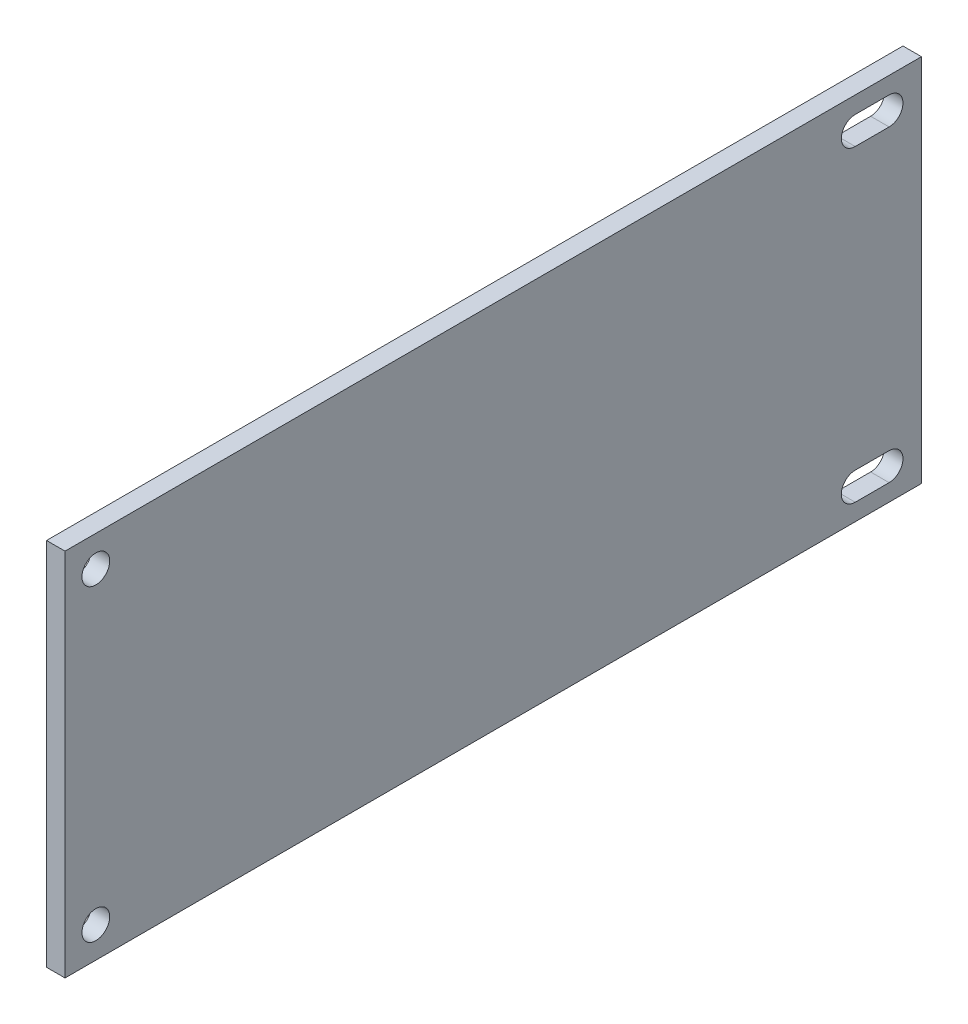
ISO-10303-21;
HEADER;
FILE_DESCRIPTION(('STEP AP214'),'2;1');
FILE_NAME('part.step','',(''),(''),'','','');
FILE_SCHEMA(('AUTOMOTIVE_DESIGN { 1 0 10303 214 1 1 1 1 }'));
ENDSEC;
DATA;
#1=APPLICATION_CONTEXT('core data for automotive mechanical design processes');
#2=APPLICATION_PROTOCOL_DEFINITION('international standard','automotive_design',2000,#1);
#3=PRODUCT_CONTEXT('',#1,'mechanical');
#4=PRODUCT('Part','Part','',(#3));
#5=PRODUCT_RELATED_PRODUCT_CATEGORY('part','',(#4));
#6=PRODUCT_DEFINITION_FORMATION('','',#4);
#7=PRODUCT_DEFINITION_CONTEXT('part definition',#1,'design');
#8=PRODUCT_DEFINITION('design','',#6,#7);
#9=PRODUCT_DEFINITION_SHAPE('','',#8);
#10=(LENGTH_UNIT() NAMED_UNIT(*) SI_UNIT(.MILLI.,.METRE.));
#11=(NAMED_UNIT(*) PLANE_ANGLE_UNIT() SI_UNIT($,.RADIAN.));
#12=(NAMED_UNIT(*) SI_UNIT($,.STERADIAN.) SOLID_ANGLE_UNIT());
#13=UNCERTAINTY_MEASURE_WITH_UNIT(LENGTH_MEASURE(1.E-05),#10,'distance_accuracy_value','');
#14=(GEOMETRIC_REPRESENTATION_CONTEXT(3) GLOBAL_UNCERTAINTY_ASSIGNED_CONTEXT((#13)) GLOBAL_UNIT_ASSIGNED_CONTEXT((#10,
#11,#12)) REPRESENTATION_CONTEXT('',''));
#15=CARTESIAN_POINT('',(0.,0.,0.));
#16=DIRECTION('',(0.,0.,1.));
#17=DIRECTION('',(1.,0.,0.));
#18=AXIS2_PLACEMENT_3D('',#15,#16,#17);
#19=CARTESIAN_POINT('',(1.5,60.,0.));
#20=DIRECTION('',(0.,0.,-1.));
#21=DIRECTION('',(-1.,0.,0.));
#22=AXIS2_PLACEMENT_3D('',#19,#20,#21);
#23=PLANE('',#22);
#24=DIRECTION('',(0.,-1.,0.));
#25=VECTOR('',#24,1.);
#26=CARTESIAN_POINT('',(-1.5,60.,0.));
#27=LINE('',#26,#25);
#28=CARTESIAN_POINT('',(-1.5,60.,0.));
#29=VERTEX_POINT('',#28);
#30=CARTESIAN_POINT('',(-1.5,0.,0.));
#31=VERTEX_POINT('',#30);
#32=EDGE_CURVE('E347',#29,#31,#27,.T.);
#33=ORIENTED_EDGE('',*,*,#32,.T.);
#34=DIRECTION('',(-1.,0.,0.));
#35=VECTOR('',#34,1.);
#36=CARTESIAN_POINT('',(1.5,0.,0.));
#37=LINE('',#36,#35);
#38=CARTESIAN_POINT('',(1.5,0.,0.));
#39=VERTEX_POINT('',#38);
#40=EDGE_CURVE('E13',#39,#31,#37,.T.);
#41=ORIENTED_EDGE('',*,*,#40,.F.);
#42=DIRECTION('',(0.,-1.,0.));
#43=VECTOR('',#42,1.);
#44=CARTESIAN_POINT('',(1.5,60.,0.));
#45=LINE('',#44,#43);
#46=CARTESIAN_POINT('',(1.5,60.,0.));
#47=VERTEX_POINT('',#46);
#48=EDGE_CURVE('E348',#47,#39,#45,.T.);
#49=ORIENTED_EDGE('',*,*,#48,.F.);
#50=DIRECTION('',(-1.,0.,0.));
#51=VECTOR('',#50,1.);
#52=CARTESIAN_POINT('',(1.5,60.,0.));
#53=LINE('',#52,#51);
#54=EDGE_CURVE('E358',#47,#29,#53,.T.);
#55=ORIENTED_EDGE('',*,*,#54,.T.);
#56=EDGE_LOOP('',(#33,#41,#49,#55));
#57=FACE_BOUND('',#56,.T.);
#58=ADVANCED_FACE('F185',(#57),#23,.F.);
#59=CARTESIAN_POINT('',(1.5,0.,-139.));
#60=DIRECTION('',(0.,1.,0.));
#61=DIRECTION('',(0.,0.,1.));
#62=AXIS2_PLACEMENT_3D('',#59,#60,#61);
#63=PLANE('',#62);
#64=DIRECTION('',(0.,0.,-1.));
#65=VECTOR('',#64,1.);
#66=CARTESIAN_POINT('',(-1.5,0.,-139.));
#67=LINE('',#66,#65);
#68=CARTESIAN_POINT('',(-1.5,0.,-139.));
#69=VERTEX_POINT('',#68);
#70=EDGE_CURVE('E361',#31,#69,#67,.T.);
#71=ORIENTED_EDGE('',*,*,#70,.T.);
#72=DIRECTION('',(-1.,0.,0.));
#73=VECTOR('',#72,1.);
#74=CARTESIAN_POINT('',(1.5,0.,-139.));
#75=LINE('',#74,#73);
#76=CARTESIAN_POINT('',(1.5,0.,-139.));
#77=VERTEX_POINT('',#76);
#78=EDGE_CURVE('E192',#77,#69,#75,.T.);
#79=ORIENTED_EDGE('',*,*,#78,.F.);
#80=DIRECTION('',(0.,0.,-1.));
#81=VECTOR('',#80,1.);
#82=CARTESIAN_POINT('',(1.5,0.,-139.));
#83=LINE('',#82,#81);
#84=EDGE_CURVE('E351',#39,#77,#83,.T.);
#85=ORIENTED_EDGE('',*,*,#84,.F.);
#86=ORIENTED_EDGE('',*,*,#40,.T.);
#87=EDGE_LOOP('',(#71,#79,#85,#86));
#88=FACE_BOUND('',#87,.T.);
#89=ADVANCED_FACE('F390',(#88),#63,.F.);
#90=CARTESIAN_POINT('',(1.5,60.,-139.));
#91=DIRECTION('',(0.,0.,1.));
#92=DIRECTION('',(1.,0.,0.));
#93=AXIS2_PLACEMENT_3D('',#90,#91,#92);
#94=PLANE('',#93);
#95=DIRECTION('',(0.,1.,0.));
#96=VECTOR('',#95,1.);
#97=CARTESIAN_POINT('',(-1.5,60.,-139.));
#98=LINE('',#97,#96);
#99=CARTESIAN_POINT('',(-1.5,60.,-139.));
#100=VERTEX_POINT('',#99);
#101=EDGE_CURVE('E363',#69,#100,#98,.T.);
#102=ORIENTED_EDGE('',*,*,#101,.T.);
#103=DIRECTION('',(-1.,0.,0.));
#104=VECTOR('',#103,1.);
#105=CARTESIAN_POINT('',(1.5,60.,-139.));
#106=LINE('',#105,#104);
#107=CARTESIAN_POINT('',(1.5,60.,-139.));
#108=VERTEX_POINT('',#107);
#109=EDGE_CURVE('E368',#108,#100,#106,.T.);
#110=ORIENTED_EDGE('',*,*,#109,.F.);
#111=DIRECTION('',(0.,1.,0.));
#112=VECTOR('',#111,1.);
#113=CARTESIAN_POINT('',(1.5,60.,-139.));
#114=LINE('',#113,#112);
#115=EDGE_CURVE('E354',#77,#108,#114,.T.);
#116=ORIENTED_EDGE('',*,*,#115,.F.);
#117=ORIENTED_EDGE('',*,*,#78,.T.);
#118=EDGE_LOOP('',(#102,#110,#116,#117));
#119=FACE_BOUND('',#118,.T.);
#120=ADVANCED_FACE('F375',(#119),#94,.F.);
#121=CARTESIAN_POINT('',(1.5,60.,-139.));
#122=DIRECTION('',(0.,-1.,0.));
#123=DIRECTION('',(0.,0.,-1.));
#124=AXIS2_PLACEMENT_3D('',#121,#122,#123);
#125=PLANE('',#124);
#126=DIRECTION('',(0.,0.,1.));
#127=VECTOR('',#126,1.);
#128=CARTESIAN_POINT('',(-1.5,60.,-139.));
#129=LINE('',#128,#127);
#130=EDGE_CURVE('E352',#100,#29,#129,.T.);
#131=ORIENTED_EDGE('',*,*,#130,.T.);
#132=ORIENTED_EDGE('',*,*,#54,.F.);
#133=DIRECTION('',(0.,0.,1.));
#134=VECTOR('',#133,1.);
#135=CARTESIAN_POINT('',(1.5,60.,-139.));
#136=LINE('',#135,#134);
#137=EDGE_CURVE('E356',#108,#47,#136,.T.);
#138=ORIENTED_EDGE('',*,*,#137,.F.);
#139=ORIENTED_EDGE('',*,*,#109,.T.);
#140=EDGE_LOOP('',(#131,#132,#138,#139));
#141=FACE_BOUND('',#140,.T.);
#142=ADVANCED_FACE('F383',(#141),#125,.F.);
#143=CARTESIAN_POINT('',(1.5,0.,0.));
#144=DIRECTION('',(-1.,0.,0.));
#145=DIRECTION('',(0.,0.,1.));
#146=AXIS2_PLACEMENT_3D('',#143,#144,#145);
#147=PLANE('',#146);
#148=CARTESIAN_POINT('',(1.5,55.,-133.75));
#149=DIRECTION('',(1.,0.,0.));
#150=DIRECTION('',(0.,0.,-1.));
#151=AXIS2_PLACEMENT_3D('',#148,#149,#150);
#152=CIRCLE('',#151,2.25);
#153=CARTESIAN_POINT('',(1.5,52.75,-133.75));
#154=VERTEX_POINT('',#153);
#155=CARTESIAN_POINT('',(1.5,57.25,-133.75));
#156=VERTEX_POINT('',#155);
#157=EDGE_CURVE('E285',#154,#156,#152,.T.);
#158=ORIENTED_EDGE('',*,*,#157,.F.);
#159=DIRECTION('',(0.,0.,1.));
#160=VECTOR('',#159,1.);
#161=CARTESIAN_POINT('',(1.5,52.75,-133.75));
#162=LINE('',#161,#160);
#163=CARTESIAN_POINT('',(1.5,52.75,-128.25));
#164=VERTEX_POINT('',#163);
#165=EDGE_CURVE('E287',#154,#164,#162,.T.);
#166=ORIENTED_EDGE('',*,*,#165,.T.);
#167=CARTESIAN_POINT('',(1.5,55.,-128.25));
#168=DIRECTION('',(1.,0.,0.));
#169=DIRECTION('',(0.,0.,-1.));
#170=AXIS2_PLACEMENT_3D('',#167,#168,#169);
#171=CIRCLE('',#170,2.25);
#172=CARTESIAN_POINT('',(1.5,57.25,-128.25));
#173=VERTEX_POINT('',#172);
#174=EDGE_CURVE('E297',#173,#164,#171,.T.);
#175=ORIENTED_EDGE('',*,*,#174,.F.);
#176=DIRECTION('',(0.,0.,1.));
#177=VECTOR('',#176,1.);
#178=CARTESIAN_POINT('',(1.5,57.25,-133.75));
#179=LINE('',#178,#177);
#180=EDGE_CURVE('E276',#156,#173,#179,.T.);
#181=ORIENTED_EDGE('',*,*,#180,.F.);
#182=EDGE_LOOP('',(#158,#166,#175,#181));
#183=FACE_BOUND('',#182,.T.);
#184=CARTESIAN_POINT('',(1.5,5.,-133.75));
#185=DIRECTION('',(1.,0.,0.));
#186=DIRECTION('',(0.,0.,-1.));
#187=AXIS2_PLACEMENT_3D('',#184,#185,#186);
#188=CIRCLE('',#187,2.25);
#189=CARTESIAN_POINT('',(1.5,2.75000000000006,-133.75));
#190=VERTEX_POINT('',#189);
#191=CARTESIAN_POINT('',(1.5,7.25,-133.75));
#192=VERTEX_POINT('',#191);
#193=EDGE_CURVE('E317',#190,#192,#188,.T.);
#194=ORIENTED_EDGE('',*,*,#193,.F.);
#195=DIRECTION('',(0.,0.,1.));
#196=VECTOR('',#195,1.);
#197=CARTESIAN_POINT('',(1.5,2.75,-133.75));
#198=LINE('',#197,#196);
#199=CARTESIAN_POINT('',(1.5,2.75,-128.25));
#200=VERTEX_POINT('',#199);
#201=EDGE_CURVE('E311',#190,#200,#198,.T.);
#202=ORIENTED_EDGE('',*,*,#201,.T.);
#203=CARTESIAN_POINT('',(1.5,5.,-128.25));
#204=DIRECTION('',(1.,0.,0.));
#205=DIRECTION('',(0.,0.,-1.));
#206=AXIS2_PLACEMENT_3D('',#203,#204,#205);
#207=CIRCLE('',#206,2.25);
#208=CARTESIAN_POINT('',(1.5,7.25000000000005,-128.25));
#209=VERTEX_POINT('',#208);
#210=EDGE_CURVE('E327',#209,#200,#207,.T.);
#211=ORIENTED_EDGE('',*,*,#210,.F.);
#212=DIRECTION('',(0.,0.,1.));
#213=VECTOR('',#212,1.);
#214=CARTESIAN_POINT('',(1.5,7.25000000000005,-133.75));
#215=LINE('',#214,#213);
#216=EDGE_CURVE('E304',#192,#209,#215,.T.);
#217=ORIENTED_EDGE('',*,*,#216,.F.);
#218=EDGE_LOOP('',(#194,#202,#211,#217));
#219=FACE_BOUND('',#218,.T.);
#220=CARTESIAN_POINT('',(1.5,55.,-5.));
#221=DIRECTION('',(1.,0.,0.));
#222=DIRECTION('',(0.,0.,-1.));
#223=AXIS2_PLACEMENT_3D('',#220,#221,#222);
#224=CIRCLE('',#223,2.25);
#225=CARTESIAN_POINT('',(1.5,55.,-7.25));
#226=VERTEX_POINT('',#225);
#227=EDGE_CURVE('E335',#226,#226,#224,.T.);
#228=ORIENTED_EDGE('',*,*,#227,.F.);
#229=EDGE_LOOP('',(#228));
#230=FACE_BOUND('',#229,.T.);
#231=CARTESIAN_POINT('',(1.5,5.,-5.));
#232=DIRECTION('',(1.,0.,0.));
#233=DIRECTION('',(0.,0.,-1.));
#234=AXIS2_PLACEMENT_3D('',#231,#232,#233);
#235=CIRCLE('',#234,2.25);
#236=CARTESIAN_POINT('',(1.5,5.,-7.25));
#237=VERTEX_POINT('',#236);
#238=EDGE_CURVE('E341',#237,#237,#235,.T.);
#239=ORIENTED_EDGE('',*,*,#238,.F.);
#240=EDGE_LOOP('',(#239));
#241=FACE_BOUND('',#240,.T.);
#242=ORIENTED_EDGE('',*,*,#48,.T.);
#243=ORIENTED_EDGE('',*,*,#84,.T.);
#244=ORIENTED_EDGE('',*,*,#115,.T.);
#245=ORIENTED_EDGE('',*,*,#137,.T.);
#246=EDGE_LOOP('',(#242,#243,#244,#245));
#247=FACE_BOUND('',#246,.T.);
#248=ADVANCED_FACE('F389',(#183,#219,#230,#241,#247),#147,.F.);
#249=CARTESIAN_POINT('',(-1.5,0.,0.));
#250=DIRECTION('',(-1.,0.,0.));
#251=DIRECTION('',(0.,0.,1.));
#252=AXIS2_PLACEMENT_3D('',#249,#250,#251);
#253=PLANE('',#252);
#254=DIRECTION('',(0.,0.,1.));
#255=VECTOR('',#254,1.);
#256=CARTESIAN_POINT('',(-1.5,52.75,-133.75));
#257=LINE('',#256,#255);
#258=CARTESIAN_POINT('',(-1.5,52.75,-133.75));
#259=VERTEX_POINT('',#258);
#260=CARTESIAN_POINT('',(-1.5,52.75,-128.25));
#261=VERTEX_POINT('',#260);
#262=EDGE_CURVE('E275',#259,#261,#257,.T.);
#263=ORIENTED_EDGE('',*,*,#262,.F.);
#264=CARTESIAN_POINT('',(-1.5,55.,-133.75));
#265=DIRECTION('',(1.,0.,0.));
#266=DIRECTION('',(0.,0.,-1.));
#267=AXIS2_PLACEMENT_3D('',#264,#265,#266);
#268=CIRCLE('',#267,2.25);
#269=CARTESIAN_POINT('',(-1.5,57.25,-133.75));
#270=VERTEX_POINT('',#269);
#271=EDGE_CURVE('E282',#259,#270,#268,.T.);
#272=ORIENTED_EDGE('',*,*,#271,.T.);
#273=DIRECTION('',(0.,0.,1.));
#274=VECTOR('',#273,1.);
#275=CARTESIAN_POINT('',(-1.5,57.25,-133.75));
#276=LINE('',#275,#274);
#277=CARTESIAN_POINT('',(-1.5,57.25,-128.25));
#278=VERTEX_POINT('',#277);
#279=EDGE_CURVE('E270',#270,#278,#276,.T.);
#280=ORIENTED_EDGE('',*,*,#279,.T.);
#281=CARTESIAN_POINT('',(-1.5,55.,-128.25));
#282=DIRECTION('',(1.,0.,0.));
#283=DIRECTION('',(0.,0.,-1.));
#284=AXIS2_PLACEMENT_3D('',#281,#282,#283);
#285=CIRCLE('',#284,2.25);
#286=EDGE_CURVE('E300',#278,#261,#285,.T.);
#287=ORIENTED_EDGE('',*,*,#286,.T.);
#288=EDGE_LOOP('',(#263,#272,#280,#287));
#289=FACE_BOUND('',#288,.T.);
#290=DIRECTION('',(0.,0.,1.));
#291=VECTOR('',#290,1.);
#292=CARTESIAN_POINT('',(-1.5,2.75,-133.75));
#293=LINE('',#292,#291);
#294=CARTESIAN_POINT('',(-1.5,2.75,-133.75));
#295=VERTEX_POINT('',#294);
#296=CARTESIAN_POINT('',(-1.5,2.75,-128.25));
#297=VERTEX_POINT('',#296);
#298=EDGE_CURVE('E309',#295,#297,#293,.T.);
#299=ORIENTED_EDGE('',*,*,#298,.F.);
#300=CARTESIAN_POINT('',(-1.5,5.,-133.75));
#301=DIRECTION('',(1.,0.,0.));
#302=DIRECTION('',(0.,0.,-1.));
#303=AXIS2_PLACEMENT_3D('',#300,#301,#302);
#304=CIRCLE('',#303,2.25);
#305=CARTESIAN_POINT('',(-1.5,7.25,-133.75));
#306=VERTEX_POINT('',#305);
#307=EDGE_CURVE('E320',#295,#306,#304,.T.);
#308=ORIENTED_EDGE('',*,*,#307,.T.);
#309=DIRECTION('',(0.,0.,1.));
#310=VECTOR('',#309,1.);
#311=CARTESIAN_POINT('',(-1.5,7.25,-133.75));
#312=LINE('',#311,#310);
#313=CARTESIAN_POINT('',(-1.5,7.25,-128.25));
#314=VERTEX_POINT('',#313);
#315=EDGE_CURVE('E306',#306,#314,#312,.T.);
#316=ORIENTED_EDGE('',*,*,#315,.T.);
#317=CARTESIAN_POINT('',(-1.5,5.,-128.25));
#318=DIRECTION('',(1.,0.,0.));
#319=DIRECTION('',(0.,0.,-1.));
#320=AXIS2_PLACEMENT_3D('',#317,#318,#319);
#321=CIRCLE('',#320,2.25);
#322=EDGE_CURVE('E330',#314,#297,#321,.T.);
#323=ORIENTED_EDGE('',*,*,#322,.T.);
#324=EDGE_LOOP('',(#299,#308,#316,#323));
#325=FACE_BOUND('',#324,.T.);
#326=CARTESIAN_POINT('',(-1.5,55.,-5.));
#327=DIRECTION('',(1.,0.,0.));
#328=DIRECTION('',(0.,0.,-1.));
#329=AXIS2_PLACEMENT_3D('',#326,#327,#328);
#330=CIRCLE('',#329,2.25);
#331=CARTESIAN_POINT('',(-1.5,55.,-7.25));
#332=VERTEX_POINT('',#331);
#333=EDGE_CURVE('E338',#332,#332,#330,.T.);
#334=ORIENTED_EDGE('',*,*,#333,.T.);
#335=EDGE_LOOP('',(#334));
#336=FACE_BOUND('',#335,.T.);
#337=CARTESIAN_POINT('',(-1.5,5.,-5.));
#338=DIRECTION('',(1.,0.,0.));
#339=DIRECTION('',(0.,0.,-1.));
#340=AXIS2_PLACEMENT_3D('',#337,#338,#339);
#341=CIRCLE('',#340,2.25);
#342=CARTESIAN_POINT('',(-1.5,5.,-7.25));
#343=VERTEX_POINT('',#342);
#344=EDGE_CURVE('E344',#343,#343,#341,.T.);
#345=ORIENTED_EDGE('',*,*,#344,.T.);
#346=EDGE_LOOP('',(#345));
#347=FACE_BOUND('',#346,.T.);
#348=ORIENTED_EDGE('',*,*,#32,.F.);
#349=ORIENTED_EDGE('',*,*,#130,.F.);
#350=ORIENTED_EDGE('',*,*,#101,.F.);
#351=ORIENTED_EDGE('',*,*,#70,.F.);
#352=EDGE_LOOP('',(#348,#349,#350,#351));
#353=FACE_BOUND('',#352,.T.);
#354=ADVANCED_FACE('F289',(#289,#325,#336,#347,#353),#253,.T.);
#355=CARTESIAN_POINT('',(1.5,5.,-5.));
#356=DIRECTION('',(1.,0.,0.));
#357=DIRECTION('',(0.,0.,-1.));
#358=AXIS2_PLACEMENT_3D('',#355,#356,#357);
#359=CYLINDRICAL_SURFACE('',#358,2.25);
#360=ORIENTED_EDGE('',*,*,#344,.F.);
#361=EDGE_LOOP('',(#360));
#362=FACE_BOUND('',#361,.T.);
#363=ORIENTED_EDGE('',*,*,#238,.T.);
#364=EDGE_LOOP('',(#363));
#365=FACE_BOUND('',#364,.T.);
#366=ADVANCED_FACE('F402',(#362,#365),#359,.F.);
#367=CARTESIAN_POINT('',(1.5,55.,-5.));
#368=DIRECTION('',(1.,0.,0.));
#369=DIRECTION('',(0.,0.,-1.));
#370=AXIS2_PLACEMENT_3D('',#367,#368,#369);
#371=CYLINDRICAL_SURFACE('',#370,2.25);
#372=ORIENTED_EDGE('',*,*,#333,.F.);
#373=EDGE_LOOP('',(#372));
#374=FACE_BOUND('',#373,.T.);
#375=ORIENTED_EDGE('',*,*,#227,.T.);
#376=EDGE_LOOP('',(#375));
#377=FACE_BOUND('',#376,.T.);
#378=ADVANCED_FACE('F408',(#374,#377),#371,.F.);
#379=CARTESIAN_POINT('',(1.5,5.,-128.25));
#380=DIRECTION('',(1.,0.,0.));
#381=DIRECTION('',(0.,0.,-1.));
#382=AXIS2_PLACEMENT_3D('',#379,#380,#381);
#383=CYLINDRICAL_SURFACE('',#382,2.25);
#384=ORIENTED_EDGE('',*,*,#322,.F.);
#385=DIRECTION('',(-1.,0.,0.));
#386=VECTOR('',#385,1.);
#387=CARTESIAN_POINT('',(-1.5,7.25,-128.25));
#388=LINE('',#387,#386);
#389=EDGE_CURVE('E325',#209,#314,#388,.T.);
#390=ORIENTED_EDGE('',*,*,#389,.F.);
#391=ORIENTED_EDGE('',*,*,#210,.T.);
#392=DIRECTION('',(1.,0.,0.));
#393=VECTOR('',#392,1.);
#394=CARTESIAN_POINT('',(1.5,2.75,-128.25));
#395=LINE('',#394,#393);
#396=EDGE_CURVE('E333',#297,#200,#395,.T.);
#397=ORIENTED_EDGE('',*,*,#396,.F.);
#398=EDGE_LOOP('',(#384,#390,#391,#397));
#399=FACE_BOUND('',#398,.T.);
#400=ADVANCED_FACE('F412',(#399),#383,.F.);
#401=CARTESIAN_POINT('',(1.5,5.,-133.75));
#402=DIRECTION('',(1.,0.,0.));
#403=DIRECTION('',(0.,0.,-1.));
#404=AXIS2_PLACEMENT_3D('',#401,#402,#403);
#405=CYLINDRICAL_SURFACE('',#404,2.25);
#406=ORIENTED_EDGE('',*,*,#193,.T.);
#407=DIRECTION('',(-1.,0.,0.));
#408=VECTOR('',#407,1.);
#409=CARTESIAN_POINT('',(-1.5,7.25,-133.75));
#410=LINE('',#409,#408);
#411=EDGE_CURVE('E314',#192,#306,#410,.T.);
#412=ORIENTED_EDGE('',*,*,#411,.T.);
#413=ORIENTED_EDGE('',*,*,#307,.F.);
#414=DIRECTION('',(1.,0.,0.));
#415=VECTOR('',#414,1.);
#416=CARTESIAN_POINT('',(1.5,2.75,-133.75));
#417=LINE('',#416,#415);
#418=EDGE_CURVE('E323',#190,#295,#417,.F.);
#419=ORIENTED_EDGE('',*,*,#418,.F.);
#420=EDGE_LOOP('',(#406,#412,#413,#419));
#421=FACE_BOUND('',#420,.T.);
#422=ADVANCED_FACE('F416',(#421),#405,.F.);
#423=CARTESIAN_POINT('',(1.5,2.75,-133.75));
#424=DIRECTION('',(0.,-1.,0.));
#425=DIRECTION('',(0.,0.,-1.));
#426=AXIS2_PLACEMENT_3D('',#423,#424,#425);
#427=PLANE('',#426);
#428=ORIENTED_EDGE('',*,*,#396,.T.);
#429=ORIENTED_EDGE('',*,*,#201,.F.);
#430=ORIENTED_EDGE('',*,*,#418,.T.);
#431=ORIENTED_EDGE('',*,*,#298,.T.);
#432=EDGE_LOOP('',(#428,#429,#430,#431));
#433=FACE_BOUND('',#432,.T.);
#434=ADVANCED_FACE('F420',(#433),#427,.F.);
#435=CARTESIAN_POINT('',(-1.5,7.25,-133.75));
#436=DIRECTION('',(0.,1.,0.));
#437=DIRECTION('',(-1.,0.,0.));
#438=AXIS2_PLACEMENT_3D('',#435,#436,#437);
#439=PLANE('',#438);
#440=ORIENTED_EDGE('',*,*,#389,.T.);
#441=ORIENTED_EDGE('',*,*,#315,.F.);
#442=ORIENTED_EDGE('',*,*,#411,.F.);
#443=ORIENTED_EDGE('',*,*,#216,.T.);
#444=EDGE_LOOP('',(#440,#441,#442,#443));
#445=FACE_BOUND('',#444,.T.);
#446=ADVANCED_FACE('F424',(#445),#439,.F.);
#447=CARTESIAN_POINT('',(1.5,55.,-128.25));
#448=DIRECTION('',(1.,0.,0.));
#449=DIRECTION('',(0.,0.,-1.));
#450=AXIS2_PLACEMENT_3D('',#447,#448,#449);
#451=CYLINDRICAL_SURFACE('',#450,2.25);
#452=ORIENTED_EDGE('',*,*,#286,.F.);
#453=DIRECTION('',(-1.,0.,0.));
#454=VECTOR('',#453,1.);
#455=CARTESIAN_POINT('',(-1.5,57.25,-128.25));
#456=LINE('',#455,#454);
#457=EDGE_CURVE('E204',#173,#278,#456,.T.);
#458=ORIENTED_EDGE('',*,*,#457,.F.);
#459=ORIENTED_EDGE('',*,*,#174,.T.);
#460=DIRECTION('',(1.,0.,0.));
#461=VECTOR('',#460,1.);
#462=CARTESIAN_POINT('',(1.5,52.75,-128.25));
#463=LINE('',#462,#461);
#464=EDGE_CURVE('E302',#261,#164,#463,.T.);
#465=ORIENTED_EDGE('',*,*,#464,.F.);
#466=EDGE_LOOP('',(#452,#458,#459,#465));
#467=FACE_BOUND('',#466,.T.);
#468=ADVANCED_FACE('F428',(#467),#451,.F.);
#469=CARTESIAN_POINT('',(1.5,55.,-133.75));
#470=DIRECTION('',(1.,0.,0.));
#471=DIRECTION('',(0.,0.,-1.));
#472=AXIS2_PLACEMENT_3D('',#469,#470,#471);
#473=CYLINDRICAL_SURFACE('',#472,2.25);
#474=ORIENTED_EDGE('',*,*,#157,.T.);
#475=DIRECTION('',(-1.,0.,0.));
#476=VECTOR('',#475,1.);
#477=CARTESIAN_POINT('',(-1.5,57.25,-133.75));
#478=LINE('',#477,#476);
#479=EDGE_CURVE('E199',#156,#270,#478,.T.);
#480=ORIENTED_EDGE('',*,*,#479,.T.);
#481=ORIENTED_EDGE('',*,*,#271,.F.);
#482=DIRECTION('',(1.,0.,0.));
#483=VECTOR('',#482,1.);
#484=CARTESIAN_POINT('',(1.5,52.75,-133.75));
#485=LINE('',#484,#483);
#486=EDGE_CURVE('E291',#154,#259,#485,.F.);
#487=ORIENTED_EDGE('',*,*,#486,.F.);
#488=EDGE_LOOP('',(#474,#480,#481,#487));
#489=FACE_BOUND('',#488,.T.);
#490=ADVANCED_FACE('F280',(#489),#473,.F.);
#491=CARTESIAN_POINT('',(1.5,52.75,-133.75));
#492=DIRECTION('',(0.,-1.,0.));
#493=DIRECTION('',(0.,0.,-1.));
#494=AXIS2_PLACEMENT_3D('',#491,#492,#493);
#495=PLANE('',#494);
#496=ORIENTED_EDGE('',*,*,#464,.T.);
#497=ORIENTED_EDGE('',*,*,#165,.F.);
#498=ORIENTED_EDGE('',*,*,#486,.T.);
#499=ORIENTED_EDGE('',*,*,#262,.T.);
#500=EDGE_LOOP('',(#496,#497,#498,#499));
#501=FACE_BOUND('',#500,.T.);
#502=ADVANCED_FACE('F435',(#501),#495,.F.);
#503=CARTESIAN_POINT('',(-1.5,57.25,-133.75));
#504=DIRECTION('',(0.,1.,0.));
#505=DIRECTION('',(-1.,0.,0.));
#506=AXIS2_PLACEMENT_3D('',#503,#504,#505);
#507=PLANE('',#506);
#508=ORIENTED_EDGE('',*,*,#457,.T.);
#509=ORIENTED_EDGE('',*,*,#279,.F.);
#510=ORIENTED_EDGE('',*,*,#479,.F.);
#511=ORIENTED_EDGE('',*,*,#180,.T.);
#512=EDGE_LOOP('',(#508,#509,#510,#511));
#513=FACE_BOUND('',#512,.T.);
#514=ADVANCED_FACE('F271',(#513),#507,.F.);
#515=CLOSED_SHELL('',(#58,#89,#120,#142,#248,#354,#366,#378,#400,#422,#434,#446,#468,#490,#502,#514));
#516=MANIFOLD_SOLID_BREP('B2',#515);
#517=ADVANCED_BREP_SHAPE_REPRESENTATION('',(#18,#516),#14);
#518=SHAPE_DEFINITION_REPRESENTATION(#9,#517);
ENDSEC;
END-ISO-10303-21;
